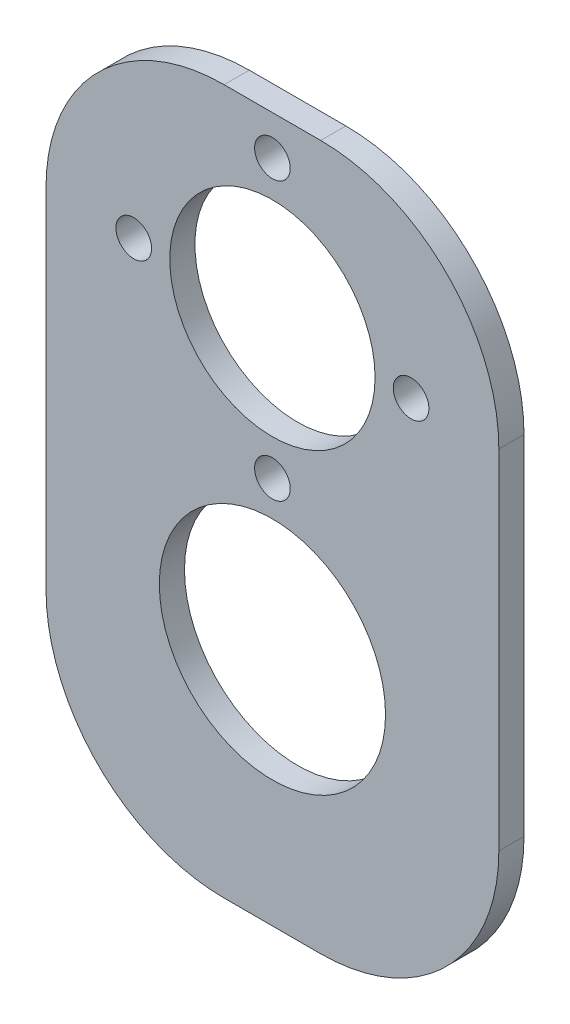
ISO-10303-21;
HEADER;
FILE_DESCRIPTION(('STEP AP214'),'2;1');
FILE_NAME('part.step','',(''),(''),'','','');
FILE_SCHEMA(('AUTOMOTIVE_DESIGN { 1 0 10303 214 1 1 1 1 }'));
ENDSEC;
DATA;
#1=APPLICATION_CONTEXT('core data for automotive mechanical design processes');
#2=APPLICATION_PROTOCOL_DEFINITION('international standard','automotive_design',2000,#1);
#3=PRODUCT_CONTEXT('',#1,'mechanical');
#4=PRODUCT('Part','Part','',(#3));
#5=PRODUCT_RELATED_PRODUCT_CATEGORY('part','',(#4));
#6=PRODUCT_DEFINITION_FORMATION('','',#4);
#7=PRODUCT_DEFINITION_CONTEXT('part definition',#1,'design');
#8=PRODUCT_DEFINITION('design','',#6,#7);
#9=PRODUCT_DEFINITION_SHAPE('','',#8);
#10=(LENGTH_UNIT() NAMED_UNIT(*) SI_UNIT(.MILLI.,.METRE.));
#11=(NAMED_UNIT(*) PLANE_ANGLE_UNIT() SI_UNIT($,.RADIAN.));
#12=(NAMED_UNIT(*) SI_UNIT($,.STERADIAN.) SOLID_ANGLE_UNIT());
#13=UNCERTAINTY_MEASURE_WITH_UNIT(LENGTH_MEASURE(1.E-05),#10,'distance_accuracy_value','');
#14=(GEOMETRIC_REPRESENTATION_CONTEXT(3) GLOBAL_UNCERTAINTY_ASSIGNED_CONTEXT((#13)) GLOBAL_UNIT_ASSIGNED_CONTEXT((#10,
#11,#12)) REPRESENTATION_CONTEXT('',''));
#15=CARTESIAN_POINT('',(0.,0.,0.));
#16=DIRECTION('',(0.,0.,1.));
#17=DIRECTION('',(1.,0.,0.));
#18=AXIS2_PLACEMENT_3D('',#15,#16,#17);
#19=CARTESIAN_POINT('',(28.575,0.,3.175));
#20=DIRECTION('',(1.,0.,0.));
#21=DIRECTION('',(0.,0.,-1.));
#22=AXIS2_PLACEMENT_3D('',#19,#20,#21);
#23=PLANE('',#22);
#24=DIRECTION('',(0.,-1.,0.));
#25=VECTOR('',#24,1.);
#26=CARTESIAN_POINT('',(28.575,0.,3.175));
#27=LINE('',#26,#25);
#28=CARTESIAN_POINT('',(28.575,31.9851755335722,3.175));
#29=VERTEX_POINT('',#28);
#30=CARTESIAN_POINT('',(28.575,-11.9568244664278,3.175));
#31=VERTEX_POINT('',#30);
#32=EDGE_CURVE('E159',#29,#31,#27,.T.);
#33=ORIENTED_EDGE('',*,*,#32,.T.);
#34=DIRECTION('',(0.,0.,-1.));
#35=VECTOR('',#34,1.);
#36=CARTESIAN_POINT('',(28.575,-11.9568244664278,3.175));
#37=LINE('',#36,#35);
#38=CARTESIAN_POINT('',(28.575,-11.9568244664278,0.));
#39=VERTEX_POINT('',#38);
#40=EDGE_CURVE('E117',#31,#39,#37,.T.);
#41=ORIENTED_EDGE('',*,*,#40,.T.);
#42=DIRECTION('',(0.,-1.,0.));
#43=VECTOR('',#42,1.);
#44=CARTESIAN_POINT('',(28.575,0.,0.));
#45=LINE('',#44,#43);
#46=CARTESIAN_POINT('',(28.575,31.9851755335722,0.));
#47=VERTEX_POINT('',#46);
#48=EDGE_CURVE('E102',#47,#39,#45,.T.);
#49=ORIENTED_EDGE('',*,*,#48,.F.);
#50=DIRECTION('',(0.,0.,-1.));
#51=VECTOR('',#50,1.);
#52=CARTESIAN_POINT('',(28.575,31.9851755335722,3.175));
#53=LINE('',#52,#51);
#54=EDGE_CURVE('E114',#47,#29,#53,.F.);
#55=ORIENTED_EDGE('',*,*,#54,.T.);
#56=EDGE_LOOP('',(#33,#41,#49,#55));
#57=FACE_BOUND('',#56,.T.);
#58=ADVANCED_FACE('F32',(#57),#23,.T.);
#59=CARTESIAN_POINT('',(0.,54.4641755335722,3.175));
#60=DIRECTION('',(0.,1.,0.));
#61=DIRECTION('',(0.,0.,1.));
#62=AXIS2_PLACEMENT_3D('',#59,#60,#61);
#63=PLANE('',#62);
#64=DIRECTION('',(1.,0.,0.));
#65=VECTOR('',#64,1.);
#66=CARTESIAN_POINT('',(0.,54.4641755335722,3.175));
#67=LINE('',#66,#65);
#68=CARTESIAN_POINT('',(-6.09600000000001,54.4641755335722,3.175));
#69=VERTEX_POINT('',#68);
#70=CARTESIAN_POINT('',(6.09599999999999,54.4641755335722,3.175));
#71=VERTEX_POINT('',#70);
#72=EDGE_CURVE('E155',#69,#71,#67,.T.);
#73=ORIENTED_EDGE('',*,*,#72,.T.);
#74=DIRECTION('',(0.,0.,-1.));
#75=VECTOR('',#74,1.);
#76=CARTESIAN_POINT('',(6.09599999999999,54.4641755335722,3.175));
#77=LINE('',#76,#75);
#78=CARTESIAN_POINT('',(6.09599999999999,54.4641755335722,0.));
#79=VERTEX_POINT('',#78);
#80=EDGE_CURVE('E11',#71,#79,#77,.T.);
#81=ORIENTED_EDGE('',*,*,#80,.T.);
#82=DIRECTION('',(1.,0.,0.));
#83=VECTOR('',#82,1.);
#84=CARTESIAN_POINT('',(0.,54.4641755335722,0.));
#85=LINE('',#84,#83);
#86=CARTESIAN_POINT('',(-6.09600000000001,54.4641755335722,0.));
#87=VERTEX_POINT('',#86);
#88=EDGE_CURVE('E104',#87,#79,#85,.T.);
#89=ORIENTED_EDGE('',*,*,#88,.F.);
#90=DIRECTION('',(0.,0.,-1.));
#91=VECTOR('',#90,1.);
#92=CARTESIAN_POINT('',(-6.09600000000001,54.4641755335722,3.175));
#93=LINE('',#92,#91);
#94=EDGE_CURVE('E40',#87,#69,#93,.F.);
#95=ORIENTED_EDGE('',*,*,#94,.T.);
#96=EDGE_LOOP('',(#73,#81,#89,#95));
#97=FACE_BOUND('',#96,.T.);
#98=ADVANCED_FACE('F154',(#97),#63,.T.);
#99=CARTESIAN_POINT('',(-28.575,0.,3.175));
#100=DIRECTION('',(1.,0.,0.));
#101=DIRECTION('',(0.,0.,-1.));
#102=AXIS2_PLACEMENT_3D('',#99,#100,#101);
#103=PLANE('',#102);
#104=DIRECTION('',(0.,-1.,0.));
#105=VECTOR('',#104,1.);
#106=CARTESIAN_POINT('',(-28.575,0.,0.));
#107=LINE('',#106,#105);
#108=CARTESIAN_POINT('',(-28.575,31.9851755335722,0.));
#109=VERTEX_POINT('',#108);
#110=CARTESIAN_POINT('',(-28.575,-11.9568244664278,0.));
#111=VERTEX_POINT('',#110);
#112=EDGE_CURVE('E164',#109,#111,#107,.T.);
#113=ORIENTED_EDGE('',*,*,#112,.T.);
#114=DIRECTION('',(0.,0.,-1.));
#115=VECTOR('',#114,1.);
#116=CARTESIAN_POINT('',(-28.575,-11.9568244664278,3.175));
#117=LINE('',#116,#115);
#118=CARTESIAN_POINT('',(-28.575,-11.9568244664278,3.175));
#119=VERTEX_POINT('',#118);
#120=EDGE_CURVE('E47',#111,#119,#117,.F.);
#121=ORIENTED_EDGE('',*,*,#120,.T.);
#122=DIRECTION('',(0.,-1.,0.));
#123=VECTOR('',#122,1.);
#124=CARTESIAN_POINT('',(-28.575,0.,3.175));
#125=LINE('',#124,#123);
#126=CARTESIAN_POINT('',(-28.575,31.9851755335722,3.175));
#127=VERTEX_POINT('',#126);
#128=EDGE_CURVE('E127',#127,#119,#125,.T.);
#129=ORIENTED_EDGE('',*,*,#128,.F.);
#130=DIRECTION('',(0.,0.,-1.));
#131=VECTOR('',#130,1.);
#132=CARTESIAN_POINT('',(-28.575,31.9851755335722,0.));
#133=LINE('',#132,#131);
#134=EDGE_CURVE('E148',#127,#109,#133,.T.);
#135=ORIENTED_EDGE('',*,*,#134,.T.);
#136=EDGE_LOOP('',(#113,#121,#129,#135));
#137=FACE_BOUND('',#136,.T.);
#138=ADVANCED_FACE('F163',(#137),#103,.F.);
#139=CARTESIAN_POINT('',(0.,31.9851755335722,3.175));
#140=DIRECTION('',(0.,0.,-1.));
#141=DIRECTION('',(-1.,0.,0.));
#142=AXIS2_PLACEMENT_3D('',#139,#140,#141);
#143=CYLINDRICAL_SURFACE('',#142,12.954);
#144=CARTESIAN_POINT('',(0.,31.9851755335722,3.175));
#145=DIRECTION('',(0.,0.,1.));
#146=DIRECTION('',(1.,0.,0.));
#147=AXIS2_PLACEMENT_3D('',#144,#145,#146);
#148=CIRCLE('',#147,12.954);
#149=CARTESIAN_POINT('',(12.954,31.9851755335722,3.175));
#150=VERTEX_POINT('',#149);
#151=EDGE_CURVE('E188',#150,#150,#148,.T.);
#152=ORIENTED_EDGE('',*,*,#151,.T.);
#153=EDGE_LOOP('',(#152));
#154=FACE_BOUND('',#153,.T.);
#155=CARTESIAN_POINT('',(0.,31.9851755335722,0.));
#156=DIRECTION('',(0.,0.,1.));
#157=DIRECTION('',(1.,0.,0.));
#158=AXIS2_PLACEMENT_3D('',#155,#156,#157);
#159=CIRCLE('',#158,12.954);
#160=CARTESIAN_POINT('',(12.954,31.9851755335722,0.));
#161=VERTEX_POINT('',#160);
#162=EDGE_CURVE('E118',#161,#161,#159,.T.);
#163=ORIENTED_EDGE('',*,*,#162,.F.);
#164=EDGE_LOOP('',(#163));
#165=FACE_BOUND('',#164,.T.);
#166=ADVANCED_FACE('F223',(#154,#165),#143,.F.);
#167=CARTESIAN_POINT('',(0.,49.4857755335722,3.175));
#168=DIRECTION('',(0.,0.,-1.));
#169=DIRECTION('',(-1.,0.,0.));
#170=AXIS2_PLACEMENT_3D('',#167,#168,#169);
#171=CYLINDRICAL_SURFACE('',#170,2.25000000000001);
#172=CARTESIAN_POINT('',(0.,49.4857755335722,3.175));
#173=DIRECTION('',(0.,0.,1.));
#174=DIRECTION('',(1.,0.,0.));
#175=AXIS2_PLACEMENT_3D('',#172,#173,#174);
#176=CIRCLE('',#175,2.25000000000001);
#177=CARTESIAN_POINT('',(2.25000000000001,49.4857755335722,3.175));
#178=VERTEX_POINT('',#177);
#179=EDGE_CURVE('E191',#178,#178,#176,.T.);
#180=ORIENTED_EDGE('',*,*,#179,.T.);
#181=EDGE_LOOP('',(#180));
#182=FACE_BOUND('',#181,.T.);
#183=CARTESIAN_POINT('',(0.,49.4857755335722,0.));
#184=DIRECTION('',(0.,0.,1.));
#185=DIRECTION('',(1.,0.,0.));
#186=AXIS2_PLACEMENT_3D('',#183,#184,#185);
#187=CIRCLE('',#186,2.25000000000001);
#188=CARTESIAN_POINT('',(2.25000000000001,49.4857755335722,0.));
#189=VERTEX_POINT('',#188);
#190=EDGE_CURVE('E171',#189,#189,#187,.T.);
#191=ORIENTED_EDGE('',*,*,#190,.F.);
#192=EDGE_LOOP('',(#191));
#193=FACE_BOUND('',#192,.T.);
#194=ADVANCED_FACE('F226',(#182,#193),#171,.F.);
#195=CARTESIAN_POINT('',(17.5006,31.9851755335722,3.175));
#196=DIRECTION('',(0.,0.,-1.));
#197=DIRECTION('',(-1.,0.,0.));
#198=AXIS2_PLACEMENT_3D('',#195,#196,#197);
#199=CYLINDRICAL_SURFACE('',#198,2.25);
#200=CARTESIAN_POINT('',(17.5006,31.9851755335722,3.175));
#201=DIRECTION('',(0.,0.,1.));
#202=DIRECTION('',(1.,0.,0.));
#203=AXIS2_PLACEMENT_3D('',#200,#201,#202);
#204=CIRCLE('',#203,2.25);
#205=CARTESIAN_POINT('',(19.7506,31.9851755335722,3.175));
#206=VERTEX_POINT('',#205);
#207=EDGE_CURVE('E194',#206,#206,#204,.T.);
#208=ORIENTED_EDGE('',*,*,#207,.T.);
#209=EDGE_LOOP('',(#208));
#210=FACE_BOUND('',#209,.T.);
#211=CARTESIAN_POINT('',(17.5006,31.9851755335722,0.));
#212=DIRECTION('',(0.,0.,1.));
#213=DIRECTION('',(1.,0.,0.));
#214=AXIS2_PLACEMENT_3D('',#211,#212,#213);
#215=CIRCLE('',#214,2.25);
#216=CARTESIAN_POINT('',(19.7506,31.9851755335722,0.));
#217=VERTEX_POINT('',#216);
#218=EDGE_CURVE('E174',#217,#217,#215,.T.);
#219=ORIENTED_EDGE('',*,*,#218,.F.);
#220=EDGE_LOOP('',(#219));
#221=FACE_BOUND('',#220,.T.);
#222=ADVANCED_FACE('F252',(#210,#221),#199,.F.);
#223=CARTESIAN_POINT('',(0.,14.4845755335722,3.175));
#224=DIRECTION('',(0.,0.,-1.));
#225=DIRECTION('',(-1.,0.,0.));
#226=AXIS2_PLACEMENT_3D('',#223,#224,#225);
#227=CYLINDRICAL_SURFACE('',#226,2.25);
#228=CARTESIAN_POINT('',(0.,14.4845755335722,3.175));
#229=DIRECTION('',(0.,0.,1.));
#230=DIRECTION('',(1.,0.,0.));
#231=AXIS2_PLACEMENT_3D('',#228,#229,#230);
#232=CIRCLE('',#231,2.25);
#233=CARTESIAN_POINT('',(2.25000000000001,14.4845755335722,3.175));
#234=VERTEX_POINT('',#233);
#235=EDGE_CURVE('E197',#234,#234,#232,.T.);
#236=ORIENTED_EDGE('',*,*,#235,.T.);
#237=EDGE_LOOP('',(#236));
#238=FACE_BOUND('',#237,.T.);
#239=CARTESIAN_POINT('',(0.,14.4845755335722,0.));
#240=DIRECTION('',(0.,0.,1.));
#241=DIRECTION('',(1.,0.,0.));
#242=AXIS2_PLACEMENT_3D('',#239,#240,#241);
#243=CIRCLE('',#242,2.25);
#244=CARTESIAN_POINT('',(2.25000000000001,14.4845755335722,0.));
#245=VERTEX_POINT('',#244);
#246=EDGE_CURVE('E177',#245,#245,#243,.T.);
#247=ORIENTED_EDGE('',*,*,#246,.F.);
#248=EDGE_LOOP('',(#247));
#249=FACE_BOUND('',#248,.T.);
#250=ADVANCED_FACE('F256',(#238,#249),#227,.F.);
#251=CARTESIAN_POINT('',(-17.5006,31.9851755335722,3.175));
#252=DIRECTION('',(0.,0.,-1.));
#253=DIRECTION('',(-1.,0.,0.));
#254=AXIS2_PLACEMENT_3D('',#251,#252,#253);
#255=CYLINDRICAL_SURFACE('',#254,2.25000000000001);
#256=CARTESIAN_POINT('',(-17.5006,31.9851755335722,3.175));
#257=DIRECTION('',(0.,0.,1.));
#258=DIRECTION('',(1.,0.,0.));
#259=AXIS2_PLACEMENT_3D('',#256,#257,#258);
#260=CIRCLE('',#259,2.25000000000001);
#261=CARTESIAN_POINT('',(-15.2506,31.9851755335722,3.175));
#262=VERTEX_POINT('',#261);
#263=EDGE_CURVE('E200',#262,#262,#260,.T.);
#264=ORIENTED_EDGE('',*,*,#263,.T.);
#265=EDGE_LOOP('',(#264));
#266=FACE_BOUND('',#265,.T.);
#267=CARTESIAN_POINT('',(-17.5006,31.9851755335722,0.));
#268=DIRECTION('',(0.,0.,1.));
#269=DIRECTION('',(1.,0.,0.));
#270=AXIS2_PLACEMENT_3D('',#267,#268,#269);
#271=CIRCLE('',#270,2.25000000000001);
#272=CARTESIAN_POINT('',(-15.2506,31.9851755335722,0.));
#273=VERTEX_POINT('',#272);
#274=EDGE_CURVE('E180',#273,#273,#271,.T.);
#275=ORIENTED_EDGE('',*,*,#274,.F.);
#276=EDGE_LOOP('',(#275));
#277=FACE_BOUND('',#276,.T.);
#278=ADVANCED_FACE('F260',(#266,#277),#255,.F.);
#279=CARTESIAN_POINT('',(0.,-4.20982446642777,3.175));
#280=DIRECTION('',(0.,0.,-1.));
#281=DIRECTION('',(-1.,0.,0.));
#282=AXIS2_PLACEMENT_3D('',#279,#280,#281);
#283=CYLINDRICAL_SURFACE('',#282,14.2748);
#284=CARTESIAN_POINT('',(0.,-4.20982446642777,3.175));
#285=DIRECTION('',(0.,0.,1.));
#286=DIRECTION('',(1.,0.,0.));
#287=AXIS2_PLACEMENT_3D('',#284,#285,#286);
#288=CIRCLE('',#287,14.2748);
#289=CARTESIAN_POINT('',(14.2748,-4.20982446642777,3.175));
#290=VERTEX_POINT('',#289);
#291=EDGE_CURVE('E166',#290,#290,#288,.T.);
#292=ORIENTED_EDGE('',*,*,#291,.T.);
#293=EDGE_LOOP('',(#292));
#294=FACE_BOUND('',#293,.T.);
#295=CARTESIAN_POINT('',(0.,-4.20982446642777,0.));
#296=DIRECTION('',(0.,0.,1.));
#297=DIRECTION('',(1.,0.,0.));
#298=AXIS2_PLACEMENT_3D('',#295,#296,#297);
#299=CIRCLE('',#298,14.2748);
#300=CARTESIAN_POINT('',(14.2748,-4.20982446642777,0.));
#301=VERTEX_POINT('',#300);
#302=EDGE_CURVE('E183',#301,#301,#299,.T.);
#303=ORIENTED_EDGE('',*,*,#302,.F.);
#304=EDGE_LOOP('',(#303));
#305=FACE_BOUND('',#304,.T.);
#306=ADVANCED_FACE('F206',(#294,#305),#283,.F.);
#307=CARTESIAN_POINT('',(0.,-34.4358244664278,3.175));
#308=DIRECTION('',(0.,-1.,0.));
#309=DIRECTION('',(0.,0.,-1.));
#310=AXIS2_PLACEMENT_3D('',#307,#308,#309);
#311=PLANE('',#310);
#312=DIRECTION('',(-1.,0.,0.));
#313=VECTOR('',#312,1.);
#314=CARTESIAN_POINT('',(0.,-34.4358244664278,0.));
#315=LINE('',#314,#313);
#316=CARTESIAN_POINT('',(6.09599999999999,-34.4358244664278,0.));
#317=VERTEX_POINT('',#316);
#318=CARTESIAN_POINT('',(-6.09600000000001,-34.4358244664278,0.));
#319=VERTEX_POINT('',#318);
#320=EDGE_CURVE('E130',#317,#319,#315,.T.);
#321=ORIENTED_EDGE('',*,*,#320,.F.);
#322=DIRECTION('',(0.,0.,-1.));
#323=VECTOR('',#322,1.);
#324=CARTESIAN_POINT('',(6.09599999999999,-34.4358244664278,3.175));
#325=LINE('',#324,#323);
#326=CARTESIAN_POINT('',(6.09599999999999,-34.4358244664278,3.175));
#327=VERTEX_POINT('',#326);
#328=EDGE_CURVE('E140',#317,#327,#325,.F.);
#329=ORIENTED_EDGE('',*,*,#328,.T.);
#330=DIRECTION('',(-1.,0.,0.));
#331=VECTOR('',#330,1.);
#332=CARTESIAN_POINT('',(0.,-34.4358244664278,3.175));
#333=LINE('',#332,#331);
#334=CARTESIAN_POINT('',(-6.09600000000001,-34.4358244664278,3.175));
#335=VERTEX_POINT('',#334);
#336=EDGE_CURVE('E123',#327,#335,#333,.T.);
#337=ORIENTED_EDGE('',*,*,#336,.T.);
#338=DIRECTION('',(0.,0.,-1.));
#339=VECTOR('',#338,1.);
#340=CARTESIAN_POINT('',(-6.09600000000001,-34.4358244664278,0.));
#341=LINE('',#340,#339);
#342=EDGE_CURVE('E137',#335,#319,#341,.T.);
#343=ORIENTED_EDGE('',*,*,#342,.T.);
#344=EDGE_LOOP('',(#321,#329,#337,#343));
#345=FACE_BOUND('',#344,.T.);
#346=ADVANCED_FACE('F211',(#345),#311,.T.);
#347=CARTESIAN_POINT('',(0.,0.,3.175));
#348=DIRECTION('',(0.,0.,1.));
#349=DIRECTION('',(1.,0.,0.));
#350=AXIS2_PLACEMENT_3D('',#347,#348,#349);
#351=PLANE('',#350);
#352=ORIENTED_EDGE('',*,*,#291,.F.);
#353=EDGE_LOOP('',(#352));
#354=FACE_BOUND('',#353,.T.);
#355=ORIENTED_EDGE('',*,*,#263,.F.);
#356=EDGE_LOOP('',(#355));
#357=FACE_BOUND('',#356,.T.);
#358=ORIENTED_EDGE('',*,*,#235,.F.);
#359=EDGE_LOOP('',(#358));
#360=FACE_BOUND('',#359,.T.);
#361=ORIENTED_EDGE('',*,*,#207,.F.);
#362=EDGE_LOOP('',(#361));
#363=FACE_BOUND('',#362,.T.);
#364=ORIENTED_EDGE('',*,*,#179,.F.);
#365=EDGE_LOOP('',(#364));
#366=FACE_BOUND('',#365,.T.);
#367=ORIENTED_EDGE('',*,*,#151,.F.);
#368=EDGE_LOOP('',(#367));
#369=FACE_BOUND('',#368,.T.);
#370=ORIENTED_EDGE('',*,*,#336,.F.);
#371=CARTESIAN_POINT('',(6.09599999999999,-11.9568244664278,3.175));
#372=DIRECTION('',(0.,0.,1.));
#373=DIRECTION('',(1.,0.,0.));
#374=AXIS2_PLACEMENT_3D('',#371,#372,#373);
#375=CIRCLE('',#374,22.479);
#376=EDGE_CURVE('E146',#327,#31,#375,.T.);
#377=ORIENTED_EDGE('',*,*,#376,.T.);
#378=ORIENTED_EDGE('',*,*,#32,.F.);
#379=CARTESIAN_POINT('',(6.09599999999999,31.9851755335722,3.175));
#380=DIRECTION('',(0.,0.,1.));
#381=DIRECTION('',(1.,0.,0.));
#382=AXIS2_PLACEMENT_3D('',#379,#380,#381);
#383=CIRCLE('',#382,22.479);
#384=EDGE_CURVE('E122',#29,#71,#383,.T.);
#385=ORIENTED_EDGE('',*,*,#384,.T.);
#386=ORIENTED_EDGE('',*,*,#72,.F.);
#387=CARTESIAN_POINT('',(-6.09600000000001,31.9851755335722,3.175));
#388=DIRECTION('',(0.,0.,1.));
#389=DIRECTION('',(1.,0.,0.));
#390=AXIS2_PLACEMENT_3D('',#387,#388,#389);
#391=CIRCLE('',#390,22.479);
#392=EDGE_CURVE('E54',#69,#127,#391,.T.);
#393=ORIENTED_EDGE('',*,*,#392,.T.);
#394=ORIENTED_EDGE('',*,*,#128,.T.);
#395=CARTESIAN_POINT('',(-6.09600000000001,-11.9568244664278,3.175));
#396=DIRECTION('',(0.,0.,1.));
#397=DIRECTION('',(1.,0.,0.));
#398=AXIS2_PLACEMENT_3D('',#395,#396,#397);
#399=CIRCLE('',#398,22.479);
#400=EDGE_CURVE('E144',#119,#335,#399,.T.);
#401=ORIENTED_EDGE('',*,*,#400,.T.);
#402=EDGE_LOOP('',(#370,#377,#378,#385,#386,#393,#394,#401));
#403=FACE_BOUND('',#402,.T.);
#404=ADVANCED_FACE('F158',(#354,#357,#360,#363,#366,#369,#403),#351,.T.);
#405=CARTESIAN_POINT('',(0.,0.,0.));
#406=DIRECTION('',(0.,0.,1.));
#407=DIRECTION('',(1.,0.,0.));
#408=AXIS2_PLACEMENT_3D('',#405,#406,#407);
#409=PLANE('',#408);
#410=ORIENTED_EDGE('',*,*,#302,.T.);
#411=EDGE_LOOP('',(#410));
#412=FACE_BOUND('',#411,.T.);
#413=ORIENTED_EDGE('',*,*,#274,.T.);
#414=EDGE_LOOP('',(#413));
#415=FACE_BOUND('',#414,.T.);
#416=ORIENTED_EDGE('',*,*,#246,.T.);
#417=EDGE_LOOP('',(#416));
#418=FACE_BOUND('',#417,.T.);
#419=ORIENTED_EDGE('',*,*,#218,.T.);
#420=EDGE_LOOP('',(#419));
#421=FACE_BOUND('',#420,.T.);
#422=ORIENTED_EDGE('',*,*,#190,.T.);
#423=EDGE_LOOP('',(#422));
#424=FACE_BOUND('',#423,.T.);
#425=ORIENTED_EDGE('',*,*,#162,.T.);
#426=EDGE_LOOP('',(#425));
#427=FACE_BOUND('',#426,.T.);
#428=ORIENTED_EDGE('',*,*,#48,.T.);
#429=CARTESIAN_POINT('',(6.09599999999999,-11.9568244664278,0.));
#430=DIRECTION('',(0.,0.,1.));
#431=DIRECTION('',(1.,0.,0.));
#432=AXIS2_PLACEMENT_3D('',#429,#430,#431);
#433=CIRCLE('',#432,22.479);
#434=EDGE_CURVE('E135',#39,#317,#433,.F.);
#435=ORIENTED_EDGE('',*,*,#434,.T.);
#436=ORIENTED_EDGE('',*,*,#320,.T.);
#437=CARTESIAN_POINT('',(-6.09600000000001,-11.9568244664278,0.));
#438=DIRECTION('',(0.,0.,1.));
#439=DIRECTION('',(1.,0.,0.));
#440=AXIS2_PLACEMENT_3D('',#437,#438,#439);
#441=CIRCLE('',#440,22.479);
#442=EDGE_CURVE('E108',#319,#111,#441,.F.);
#443=ORIENTED_EDGE('',*,*,#442,.T.);
#444=ORIENTED_EDGE('',*,*,#112,.F.);
#445=CARTESIAN_POINT('',(-6.09600000000001,31.9851755335722,0.));
#446=DIRECTION('',(0.,0.,1.));
#447=DIRECTION('',(1.,0.,0.));
#448=AXIS2_PLACEMENT_3D('',#445,#446,#447);
#449=CIRCLE('',#448,22.479);
#450=EDGE_CURVE('E109',#109,#87,#449,.F.);
#451=ORIENTED_EDGE('',*,*,#450,.T.);
#452=ORIENTED_EDGE('',*,*,#88,.T.);
#453=CARTESIAN_POINT('',(6.09599999999999,31.9851755335722,0.));
#454=DIRECTION('',(0.,0.,1.));
#455=DIRECTION('',(1.,0.,0.));
#456=AXIS2_PLACEMENT_3D('',#453,#454,#455);
#457=CIRCLE('',#456,22.479);
#458=EDGE_CURVE('E99',#79,#47,#457,.F.);
#459=ORIENTED_EDGE('',*,*,#458,.T.);
#460=EDGE_LOOP('',(#428,#435,#436,#443,#444,#451,#452,#459));
#461=FACE_BOUND('',#460,.T.);
#462=ADVANCED_FACE('F101',(#412,#415,#418,#421,#424,#427,#461),#409,.F.);
#463=CARTESIAN_POINT('',(6.09599999999999,-11.9568244664278,3.175));
#464=DIRECTION('',(0.,0.,-1.));
#465=DIRECTION('',(-1.,0.,0.));
#466=AXIS2_PLACEMENT_3D('',#463,#464,#465);
#467=CYLINDRICAL_SURFACE('',#466,22.479);
#468=ORIENTED_EDGE('',*,*,#376,.F.);
#469=ORIENTED_EDGE('',*,*,#328,.F.);
#470=ORIENTED_EDGE('',*,*,#434,.F.);
#471=ORIENTED_EDGE('',*,*,#40,.F.);
#472=EDGE_LOOP('',(#468,#469,#470,#471));
#473=FACE_BOUND('',#472,.T.);
#474=ADVANCED_FACE('F231',(#473),#467,.T.);
#475=CARTESIAN_POINT('',(-6.09600000000001,-11.9568244664278,3.175));
#476=DIRECTION('',(0.,0.,1.));
#477=DIRECTION('',(1.,0.,0.));
#478=AXIS2_PLACEMENT_3D('',#475,#476,#477);
#479=CYLINDRICAL_SURFACE('',#478,22.479);
#480=ORIENTED_EDGE('',*,*,#400,.F.);
#481=ORIENTED_EDGE('',*,*,#120,.F.);
#482=ORIENTED_EDGE('',*,*,#442,.F.);
#483=ORIENTED_EDGE('',*,*,#342,.F.);
#484=EDGE_LOOP('',(#480,#481,#482,#483));
#485=FACE_BOUND('',#484,.T.);
#486=ADVANCED_FACE('F237',(#485),#479,.T.);
#487=CARTESIAN_POINT('',(6.09599999999999,31.9851755335722,3.175));
#488=DIRECTION('',(0.,0.,-1.));
#489=DIRECTION('',(-1.,0.,0.));
#490=AXIS2_PLACEMENT_3D('',#487,#488,#489);
#491=CYLINDRICAL_SURFACE('',#490,22.479);
#492=ORIENTED_EDGE('',*,*,#384,.F.);
#493=ORIENTED_EDGE('',*,*,#54,.F.);
#494=ORIENTED_EDGE('',*,*,#458,.F.);
#495=ORIENTED_EDGE('',*,*,#80,.F.);
#496=EDGE_LOOP('',(#492,#493,#494,#495));
#497=FACE_BOUND('',#496,.T.);
#498=ADVANCED_FACE('F121',(#497),#491,.T.);
#499=CARTESIAN_POINT('',(-6.09600000000001,31.9851755335722,3.175));
#500=DIRECTION('',(0.,0.,1.));
#501=DIRECTION('',(1.,0.,0.));
#502=AXIS2_PLACEMENT_3D('',#499,#500,#501);
#503=CYLINDRICAL_SURFACE('',#502,22.479);
#504=ORIENTED_EDGE('',*,*,#392,.F.);
#505=ORIENTED_EDGE('',*,*,#94,.F.);
#506=ORIENTED_EDGE('',*,*,#450,.F.);
#507=ORIENTED_EDGE('',*,*,#134,.F.);
#508=EDGE_LOOP('',(#504,#505,#506,#507));
#509=FACE_BOUND('',#508,.T.);
#510=ADVANCED_FACE('F34',(#509),#503,.T.);
#511=CLOSED_SHELL('',(#58,#98,#138,#166,#194,#222,#250,#278,#306,#346,#404,#462,#474,#486,#498,#510));
#512=MANIFOLD_SOLID_BREP('B2',#511);
#513=ADVANCED_BREP_SHAPE_REPRESENTATION('',(#18,#512),#14);
#514=SHAPE_DEFINITION_REPRESENTATION(#9,#513);
ENDSEC;
END-ISO-10303-21;
